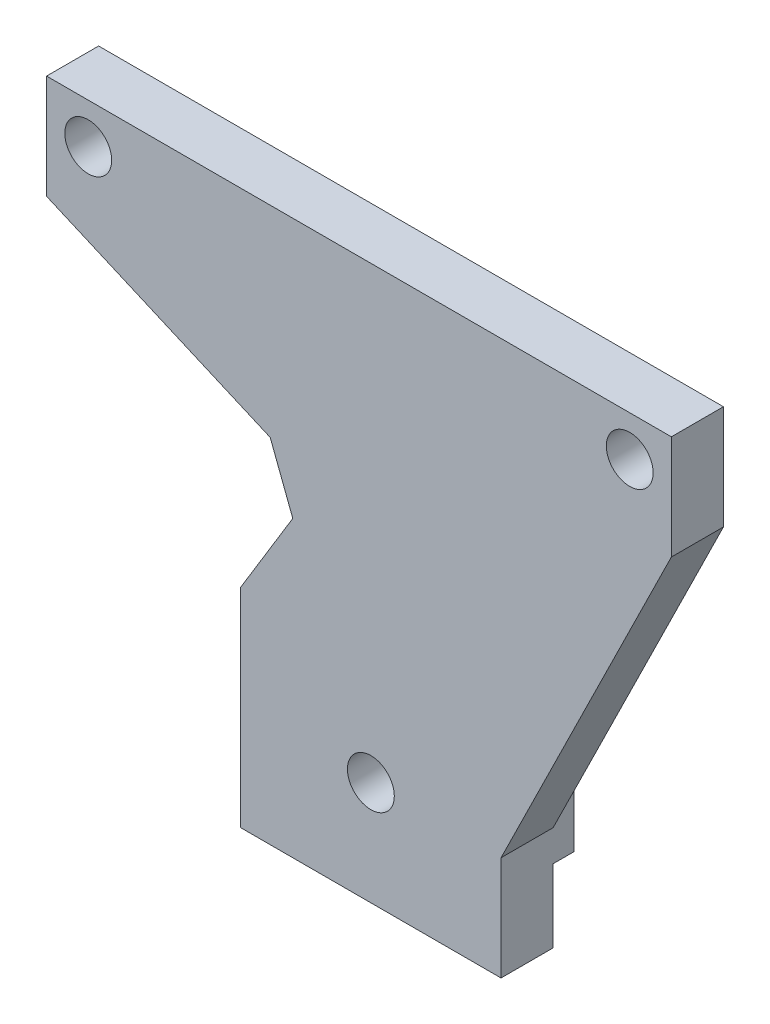
ISO-10303-21;
HEADER;
FILE_DESCRIPTION(('STEP AP214'),'2;1');
FILE_NAME('part.step','',(''),(''),'','','');
FILE_SCHEMA(('AUTOMOTIVE_DESIGN { 1 0 10303 214 1 1 1 1 }'));
ENDSEC;
DATA;
#1=APPLICATION_CONTEXT('core data for automotive mechanical design processes');
#2=APPLICATION_PROTOCOL_DEFINITION('international standard','automotive_design',2000,#1);
#3=PRODUCT_CONTEXT('',#1,'mechanical');
#4=PRODUCT('Part','Part','',(#3));
#5=PRODUCT_RELATED_PRODUCT_CATEGORY('part','',(#4));
#6=PRODUCT_DEFINITION_FORMATION('','',#4);
#7=PRODUCT_DEFINITION_CONTEXT('part definition',#1,'design');
#8=PRODUCT_DEFINITION('design','',#6,#7);
#9=PRODUCT_DEFINITION_SHAPE('','',#8);
#10=(LENGTH_UNIT() NAMED_UNIT(*) SI_UNIT(.MILLI.,.METRE.));
#11=(NAMED_UNIT(*) PLANE_ANGLE_UNIT() SI_UNIT($,.RADIAN.));
#12=(NAMED_UNIT(*) SI_UNIT($,.STERADIAN.) SOLID_ANGLE_UNIT());
#13=UNCERTAINTY_MEASURE_WITH_UNIT(LENGTH_MEASURE(1.E-05),#10,'distance_accuracy_value','');
#14=(GEOMETRIC_REPRESENTATION_CONTEXT(3) GLOBAL_UNCERTAINTY_ASSIGNED_CONTEXT((#13)) GLOBAL_UNIT_ASSIGNED_CONTEXT((#10,
#11,#12)) REPRESENTATION_CONTEXT('',''));
#15=CARTESIAN_POINT('',(0.,0.,0.));
#16=DIRECTION('',(0.,0.,1.));
#17=DIRECTION('',(1.,0.,0.));
#18=AXIS2_PLACEMENT_3D('',#15,#16,#17);
#19=CARTESIAN_POINT('',(0.,0.,0.));
#20=DIRECTION('',(-1.,0.,0.));
#21=DIRECTION('',(0.,0.,1.));
#22=AXIS2_PLACEMENT_3D('',#19,#20,#21);
#23=PLANE('',#22);
#24=DIRECTION('',(0.,-1.,0.));
#25=VECTOR('',#24,1.);
#26=CARTESIAN_POINT('',(0.,0.,5.));
#27=LINE('',#26,#25);
#28=CARTESIAN_POINT('',(0.,0.,5.));
#29=VERTEX_POINT('',#28);
#30=CARTESIAN_POINT('',(0.,-10.,5.));
#31=VERTEX_POINT('',#30);
#32=EDGE_CURVE('E46',#29,#31,#27,.T.);
#33=ORIENTED_EDGE('',*,*,#32,.T.);
#34=DIRECTION('',(0.,0.,-1.));
#35=VECTOR('',#34,1.);
#36=CARTESIAN_POINT('',(0.,-10.,5.));
#37=LINE('',#36,#35);
#38=CARTESIAN_POINT('',(0.,-10.,0.));
#39=VERTEX_POINT('',#38);
#40=EDGE_CURVE('E12',#31,#39,#37,.T.);
#41=ORIENTED_EDGE('',*,*,#40,.T.);
#42=DIRECTION('',(0.,-1.,0.));
#43=VECTOR('',#42,1.);
#44=CARTESIAN_POINT('',(0.,0.,0.));
#45=LINE('',#44,#43);
#46=CARTESIAN_POINT('',(0.,0.,0.));
#47=VERTEX_POINT('',#46);
#48=EDGE_CURVE('E54',#47,#39,#45,.T.);
#49=ORIENTED_EDGE('',*,*,#48,.F.);
#50=DIRECTION('',(0.,0.,-1.));
#51=VECTOR('',#50,1.);
#52=CARTESIAN_POINT('',(0.,0.,5.));
#53=LINE('',#52,#51);
#54=EDGE_CURVE('E41',#29,#47,#53,.T.);
#55=ORIENTED_EDGE('',*,*,#54,.F.);
#56=EDGE_LOOP('',(#33,#41,#49,#55));
#57=FACE_BOUND('',#56,.T.);
#58=ADVANCED_FACE('F38',(#57),#23,.F.);
#59=CARTESIAN_POINT('',(0.,0.,5.));
#60=DIRECTION('',(0.,-1.,0.));
#61=DIRECTION('',(0.,0.,-1.));
#62=AXIS2_PLACEMENT_3D('',#59,#60,#61);
#63=PLANE('',#62);
#64=DIRECTION('',(-1.,0.,0.));
#65=VECTOR('',#64,1.);
#66=CARTESIAN_POINT('',(0.,0.,5.));
#67=LINE('',#66,#65);
#68=CARTESIAN_POINT('',(-60.,0.,5.));
#69=VERTEX_POINT('',#68);
#70=EDGE_CURVE('E249',#29,#69,#67,.T.);
#71=ORIENTED_EDGE('',*,*,#70,.F.);
#72=ORIENTED_EDGE('',*,*,#54,.T.);
#73=DIRECTION('',(-1.,0.,0.));
#74=VECTOR('',#73,1.);
#75=CARTESIAN_POINT('',(0.,0.,0.));
#76=LINE('',#75,#74);
#77=CARTESIAN_POINT('',(-60.,0.,0.));
#78=VERTEX_POINT('',#77);
#79=EDGE_CURVE('E238',#47,#78,#76,.T.);
#80=ORIENTED_EDGE('',*,*,#79,.T.);
#81=DIRECTION('',(0.,0.,-1.));
#82=VECTOR('',#81,1.);
#83=CARTESIAN_POINT('',(-60.,0.,5.));
#84=LINE('',#83,#82);
#85=EDGE_CURVE('E197',#69,#78,#84,.T.);
#86=ORIENTED_EDGE('',*,*,#85,.F.);
#87=EDGE_LOOP('',(#71,#72,#80,#86));
#88=FACE_BOUND('',#87,.T.);
#89=ADVANCED_FACE('F257',(#88),#63,.F.);
#90=CARTESIAN_POINT('',(0.,0.,5.));
#91=DIRECTION('',(0.,0.,1.));
#92=DIRECTION('',(1.,0.,0.));
#93=AXIS2_PLACEMENT_3D('',#90,#91,#92);
#94=PLANE('',#93);
#95=ORIENTED_EDGE('',*,*,#32,.F.);
#96=ORIENTED_EDGE('',*,*,#70,.T.);
#97=DIRECTION('',(0.,1.,0.));
#98=VECTOR('',#97,1.);
#99=CARTESIAN_POINT('',(-60.,0.,5.));
#100=LINE('',#99,#98);
#101=CARTESIAN_POINT('',(-60.,-10.,5.));
#102=VERTEX_POINT('',#101);
#103=EDGE_CURVE('E195',#102,#69,#100,.T.);
#104=ORIENTED_EDGE('',*,*,#103,.F.);
#105=DIRECTION('',(-0.917432042877984,0.397892506464659,0.));
#106=VECTOR('',#105,1.);
#107=CARTESIAN_POINT('',(-38.5227399227401,-19.3147398877922,5.));
#108=LINE('',#107,#106);
#109=CARTESIAN_POINT('',(-38.5227399227401,-19.3147398877922,5.));
#110=VERTEX_POINT('',#109);
#111=EDGE_CURVE('E192',#110,#102,#108,.T.);
#112=ORIENTED_EDGE('',*,*,#111,.F.);
#113=DIRECTION('',(-0.357936011632449,0.933746117302051,0.));
#114=VECTOR('',#113,1.);
#115=CARTESIAN_POINT('',(-36.3557169880903,-24.9678431955744,5.));
#116=LINE('',#115,#114);
#117=CARTESIAN_POINT('',(-36.3557169880903,-24.9678431955744,5.));
#118=VERTEX_POINT('',#117);
#119=EDGE_CURVE('E189',#118,#110,#116,.T.);
#120=ORIENTED_EDGE('',*,*,#119,.F.);
#121=DIRECTION('',(0.519762211169418,0.854310976073864,0.));
#122=VECTOR('',#121,1.);
#123=CARTESIAN_POINT('',(-41.3569249684672,-33.1881154266996,5.));
#124=LINE('',#123,#122);
#125=CARTESIAN_POINT('',(-41.3569249684672,-33.1881154266996,5.));
#126=VERTEX_POINT('',#125);
#127=EDGE_CURVE('E186',#126,#118,#124,.T.);
#128=ORIENTED_EDGE('',*,*,#127,.F.);
#129=DIRECTION('',(0.,1.,0.));
#130=VECTOR('',#129,1.);
#131=CARTESIAN_POINT('',(-41.3569249684672,-53.1881154266996,5.));
#132=LINE('',#131,#130);
#133=CARTESIAN_POINT('',(-41.3569249684672,-53.1881154266996,5.));
#134=VERTEX_POINT('',#133);
#135=EDGE_CURVE('E183',#134,#126,#132,.T.);
#136=ORIENTED_EDGE('',*,*,#135,.F.);
#137=DIRECTION('',(-1.,0.,0.));
#138=VECTOR('',#137,1.);
#139=CARTESIAN_POINT('',(-16.3569249684672,-53.1881154266996,5.));
#140=LINE('',#139,#138);
#141=CARTESIAN_POINT('',(-16.3569249684672,-53.1881154266996,5.));
#142=VERTEX_POINT('',#141);
#143=EDGE_CURVE('E180',#142,#134,#140,.T.);
#144=ORIENTED_EDGE('',*,*,#143,.F.);
#145=DIRECTION('',(0.,-1.,0.));
#146=VECTOR('',#145,1.);
#147=CARTESIAN_POINT('',(-16.3569249684672,-43.1881154266996,5.));
#148=LINE('',#147,#146);
#149=CARTESIAN_POINT('',(-16.3569249684672,-43.1881154266996,5.));
#150=VERTEX_POINT('',#149);
#151=EDGE_CURVE('E176',#150,#142,#148,.T.);
#152=ORIENTED_EDGE('',*,*,#151,.F.);
#153=DIRECTION('',(-0.442079053201817,-0.896976092613502,0.));
#154=VECTOR('',#153,1.);
#155=CARTESIAN_POINT('',(0.,-10.,5.));
#156=LINE('',#155,#154);
#157=EDGE_CURVE('E174',#31,#150,#156,.T.);
#158=ORIENTED_EDGE('',*,*,#157,.F.);
#159=EDGE_LOOP('',(#95,#96,#104,#112,#120,#128,#136,#144,#152,#158));
#160=FACE_BOUND('',#159,.T.);
#161=CARTESIAN_POINT('',(-56.,-3.88,5.));
#162=DIRECTION('',(0.,0.,-1.));
#163=DIRECTION('',(-1.,0.,0.));
#164=AXIS2_PLACEMENT_3D('',#161,#162,#163);
#165=CIRCLE('',#164,2.25);
#166=CARTESIAN_POINT('',(-58.25,-3.88,5.));
#167=VERTEX_POINT('',#166);
#168=EDGE_CURVE('E248',#167,#167,#165,.T.);
#169=ORIENTED_EDGE('',*,*,#168,.T.);
#170=EDGE_LOOP('',(#169));
#171=FACE_BOUND('',#170,.T.);
#172=CARTESIAN_POINT('',(-4.,-3.88,5.));
#173=DIRECTION('',(0.,0.,-1.));
#174=DIRECTION('',(-1.,0.,0.));
#175=AXIS2_PLACEMENT_3D('',#172,#173,#174);
#176=CIRCLE('',#175,2.25);
#177=CARTESIAN_POINT('',(-6.25,-3.88,5.));
#178=VERTEX_POINT('',#177);
#179=EDGE_CURVE('E243',#178,#178,#176,.T.);
#180=ORIENTED_EDGE('',*,*,#179,.T.);
#181=EDGE_LOOP('',(#180));
#182=FACE_BOUND('',#181,.T.);
#183=CARTESIAN_POINT('',(-28.8569249684672,-43.1881154266996,5.));
#184=DIRECTION('',(0.,0.,-1.));
#185=DIRECTION('',(-1.,0.,0.));
#186=AXIS2_PLACEMENT_3D('',#183,#184,#185);
#187=CIRCLE('',#186,2.25);
#188=CARTESIAN_POINT('',(-31.1069249684672,-43.1881154266996,5.));
#189=VERTEX_POINT('',#188);
#190=EDGE_CURVE('E244',#189,#189,#187,.T.);
#191=ORIENTED_EDGE('',*,*,#190,.T.);
#192=EDGE_LOOP('',(#191));
#193=FACE_BOUND('',#192,.T.);
#194=ADVANCED_FACE('F268',(#160,#171,#182,#193),#94,.T.);
#195=CARTESIAN_POINT('',(0.,0.,0.));
#196=DIRECTION('',(0.,0.,1.));
#197=DIRECTION('',(1.,0.,0.));
#198=AXIS2_PLACEMENT_3D('',#195,#196,#197);
#199=PLANE('',#198);
#200=ORIENTED_EDGE('',*,*,#79,.F.);
#201=ORIENTED_EDGE('',*,*,#48,.T.);
#202=DIRECTION('',(-0.442079053201817,-0.896976092613502,0.));
#203=VECTOR('',#202,1.);
#204=CARTESIAN_POINT('',(0.,-10.,0.));
#205=LINE('',#204,#203);
#206=CARTESIAN_POINT('',(-16.3569249684672,-43.1881154266996,0.));
#207=VERTEX_POINT('',#206);
#208=EDGE_CURVE('E166',#39,#207,#205,.T.);
#209=ORIENTED_EDGE('',*,*,#208,.T.);
#210=DIRECTION('',(0.,-1.,0.));
#211=VECTOR('',#210,1.);
#212=CARTESIAN_POINT('',(-16.3569249684672,-40.1881154266996,0.));
#213=LINE('',#212,#211);
#214=CARTESIAN_POINT('',(-16.3569249684672,-40.1881154266996,0.));
#215=VERTEX_POINT('',#214);
#216=EDGE_CURVE('E273',#215,#207,#213,.T.);
#217=ORIENTED_EDGE('',*,*,#216,.F.);
#218=DIRECTION('',(1.,0.,0.));
#219=VECTOR('',#218,1.);
#220=CARTESIAN_POINT('',(-41.3569249684672,-40.1881154266996,0.));
#221=LINE('',#220,#219);
#222=CARTESIAN_POINT('',(-41.3569249684672,-40.1881154266996,0.));
#223=VERTEX_POINT('',#222);
#224=EDGE_CURVE('E152',#223,#215,#221,.T.);
#225=ORIENTED_EDGE('',*,*,#224,.F.);
#226=DIRECTION('',(0.,1.,0.));
#227=VECTOR('',#226,1.);
#228=CARTESIAN_POINT('',(-41.3569249684672,-53.1881154266996,0.));
#229=LINE('',#228,#227);
#230=CARTESIAN_POINT('',(-41.3569249684672,-33.1881154266996,0.));
#231=VERTEX_POINT('',#230);
#232=EDGE_CURVE('E203',#223,#231,#229,.T.);
#233=ORIENTED_EDGE('',*,*,#232,.T.);
#234=DIRECTION('',(0.519762211169418,0.854310976073864,0.));
#235=VECTOR('',#234,1.);
#236=CARTESIAN_POINT('',(-41.3569249684672,-33.1881154266996,0.));
#237=LINE('',#236,#235);
#238=CARTESIAN_POINT('',(-36.3557169880903,-24.9678431955744,0.));
#239=VERTEX_POINT('',#238);
#240=EDGE_CURVE('E207',#231,#239,#237,.T.);
#241=ORIENTED_EDGE('',*,*,#240,.T.);
#242=DIRECTION('',(-0.357936011632449,0.933746117302051,0.));
#243=VECTOR('',#242,1.);
#244=CARTESIAN_POINT('',(-36.3557169880903,-24.9678431955744,0.));
#245=LINE('',#244,#243);
#246=CARTESIAN_POINT('',(-38.5227399227401,-19.3147398877922,0.));
#247=VERTEX_POINT('',#246);
#248=EDGE_CURVE('E210',#239,#247,#245,.T.);
#249=ORIENTED_EDGE('',*,*,#248,.T.);
#250=DIRECTION('',(-0.917432042877984,0.397892506464659,0.));
#251=VECTOR('',#250,1.);
#252=CARTESIAN_POINT('',(-38.5227399227401,-19.3147398877922,0.));
#253=LINE('',#252,#251);
#254=CARTESIAN_POINT('',(-60.,-10.,0.));
#255=VERTEX_POINT('',#254);
#256=EDGE_CURVE('E213',#247,#255,#253,.T.);
#257=ORIENTED_EDGE('',*,*,#256,.T.);
#258=DIRECTION('',(0.,1.,0.));
#259=VECTOR('',#258,1.);
#260=CARTESIAN_POINT('',(-60.,0.,0.));
#261=LINE('',#260,#259);
#262=EDGE_CURVE('E177',#255,#78,#261,.T.);
#263=ORIENTED_EDGE('',*,*,#262,.T.);
#264=EDGE_LOOP('',(#200,#201,#209,#217,#225,#233,#241,#249,#257,#263));
#265=FACE_BOUND('',#264,.T.);
#266=CARTESIAN_POINT('',(-56.,-3.88,0.));
#267=DIRECTION('',(0.,0.,-1.));
#268=DIRECTION('',(-1.,0.,0.));
#269=AXIS2_PLACEMENT_3D('',#266,#267,#268);
#270=CIRCLE('',#269,2.25);
#271=CARTESIAN_POINT('',(-58.25,-3.88,0.));
#272=VERTEX_POINT('',#271);
#273=EDGE_CURVE('E245',#272,#272,#270,.T.);
#274=ORIENTED_EDGE('',*,*,#273,.F.);
#275=EDGE_LOOP('',(#274));
#276=FACE_BOUND('',#275,.T.);
#277=CARTESIAN_POINT('',(-4.,-3.88,0.));
#278=DIRECTION('',(0.,0.,-1.));
#279=DIRECTION('',(-1.,0.,0.));
#280=AXIS2_PLACEMENT_3D('',#277,#278,#279);
#281=CIRCLE('',#280,2.25);
#282=CARTESIAN_POINT('',(-6.25,-3.88,0.));
#283=VERTEX_POINT('',#282);
#284=EDGE_CURVE('E240',#283,#283,#281,.T.);
#285=ORIENTED_EDGE('',*,*,#284,.F.);
#286=EDGE_LOOP('',(#285));
#287=FACE_BOUND('',#286,.T.);
#288=ADVANCED_FACE('F259',(#265,#276,#287),#199,.F.);
#289=CARTESIAN_POINT('',(0.,0.,0.));
#290=DIRECTION('',(0.,0.,1.));
#291=DIRECTION('',(-1.,0.,0.));
#292=AXIS2_PLACEMENT_3D('',#289,#290,#291);
#293=PLANE('',#292);
#294=DIRECTION('',(1.,0.,0.));
#295=VECTOR('',#294,1.);
#296=CARTESIAN_POINT('',(-41.3569249684672,-46.1881154266996,0.));
#297=LINE('',#296,#295);
#298=CARTESIAN_POINT('',(-41.3569249684672,-46.1881154266996,0.));
#299=VERTEX_POINT('',#298);
#300=CARTESIAN_POINT('',(-16.3569249684672,-46.1881154266996,0.));
#301=VERTEX_POINT('',#300);
#302=EDGE_CURVE('E276',#299,#301,#297,.T.);
#303=ORIENTED_EDGE('',*,*,#302,.T.);
#304=DIRECTION('',(0.,-1.,0.));
#305=VECTOR('',#304,1.);
#306=CARTESIAN_POINT('',(-16.3569249684672,-43.1881154266996,0.));
#307=LINE('',#306,#305);
#308=CARTESIAN_POINT('',(-16.3569249684672,-53.1881154266996,0.));
#309=VERTEX_POINT('',#308);
#310=EDGE_CURVE('E164',#301,#309,#307,.T.);
#311=ORIENTED_EDGE('',*,*,#310,.T.);
#312=DIRECTION('',(-1.,0.,0.));
#313=VECTOR('',#312,1.);
#314=CARTESIAN_POINT('',(-16.3569249684672,-53.1881154266996,0.));
#315=LINE('',#314,#313);
#316=CARTESIAN_POINT('',(-41.3569249684672,-53.1881154266996,0.));
#317=VERTEX_POINT('',#316);
#318=EDGE_CURVE('E200',#309,#317,#315,.T.);
#319=ORIENTED_EDGE('',*,*,#318,.T.);
#320=EDGE_CURVE('E204',#317,#299,#229,.T.);
#321=ORIENTED_EDGE('',*,*,#320,.T.);
#322=EDGE_LOOP('',(#303,#311,#319,#321));
#323=FACE_BOUND('',#322,.T.);
#324=ADVANCED_FACE('F331',(#323),#293,.F.);
#325=CARTESIAN_POINT('',(0.,-10.,5.));
#326=DIRECTION('',(-0.896976092613502,0.442079053201817,0.));
#327=DIRECTION('',(0.442079053201817,0.896976092613502,0.));
#328=AXIS2_PLACEMENT_3D('',#325,#326,#327);
#329=PLANE('',#328);
#330=ORIENTED_EDGE('',*,*,#208,.F.);
#331=ORIENTED_EDGE('',*,*,#40,.F.);
#332=ORIENTED_EDGE('',*,*,#157,.T.);
#333=DIRECTION('',(0.,0.,-1.));
#334=VECTOR('',#333,1.);
#335=CARTESIAN_POINT('',(-16.3569249684672,-43.1881154266996,5.));
#336=LINE('',#335,#334);
#337=EDGE_CURVE('E236',#150,#207,#336,.T.);
#338=ORIENTED_EDGE('',*,*,#337,.T.);
#339=EDGE_LOOP('',(#330,#331,#332,#338));
#340=FACE_BOUND('',#339,.T.);
#341=ADVANCED_FACE('F271',(#340),#329,.F.);
#342=CARTESIAN_POINT('',(-16.3569249684672,-43.1881154266996,5.));
#343=DIRECTION('',(-1.,0.,0.));
#344=DIRECTION('',(0.,0.,-1.));
#345=AXIS2_PLACEMENT_3D('',#342,#343,#344);
#346=PLANE('',#345);
#347=ORIENTED_EDGE('',*,*,#337,.F.);
#348=ORIENTED_EDGE('',*,*,#151,.T.);
#349=DIRECTION('',(0.,0.,-1.));
#350=VECTOR('',#349,1.);
#351=CARTESIAN_POINT('',(-16.3569249684672,-53.1881154266996,5.));
#352=LINE('',#351,#350);
#353=EDGE_CURVE('E234',#142,#309,#352,.T.);
#354=ORIENTED_EDGE('',*,*,#353,.T.);
#355=ORIENTED_EDGE('',*,*,#310,.F.);
#356=DIRECTION('',(0.,0.,1.));
#357=VECTOR('',#356,1.);
#358=CARTESIAN_POINT('',(-16.3569249684672,-46.1881154266996,-2.));
#359=LINE('',#358,#357);
#360=CARTESIAN_POINT('',(-16.3569249684672,-46.1881154266996,-2.));
#361=VERTEX_POINT('',#360);
#362=EDGE_CURVE('E145',#361,#301,#359,.T.);
#363=ORIENTED_EDGE('',*,*,#362,.F.);
#364=DIRECTION('',(0.,-1.,0.));
#365=VECTOR('',#364,1.);
#366=CARTESIAN_POINT('',(-16.3569249684672,-40.1881154266996,-2.));
#367=LINE('',#366,#365);
#368=CARTESIAN_POINT('',(-16.3569249684672,-40.1881154266996,-2.));
#369=VERTEX_POINT('',#368);
#370=EDGE_CURVE('E151',#369,#361,#367,.T.);
#371=ORIENTED_EDGE('',*,*,#370,.F.);
#372=DIRECTION('',(0.,0.,1.));
#373=VECTOR('',#372,1.);
#374=CARTESIAN_POINT('',(-16.3569249684672,-40.1881154266996,-2.));
#375=LINE('',#374,#373);
#376=EDGE_CURVE('E167',#369,#215,#375,.T.);
#377=ORIENTED_EDGE('',*,*,#376,.T.);
#378=ORIENTED_EDGE('',*,*,#216,.T.);
#379=EDGE_LOOP('',(#347,#348,#354,#355,#363,#371,#377,#378));
#380=FACE_BOUND('',#379,.T.);
#381=ADVANCED_FACE('F162',(#380),#346,.F.);
#382=CARTESIAN_POINT('',(-16.3569249684672,-53.1881154266996,5.));
#383=DIRECTION('',(0.,1.,0.));
#384=DIRECTION('',(0.,0.,1.));
#385=AXIS2_PLACEMENT_3D('',#382,#383,#384);
#386=PLANE('',#385);
#387=ORIENTED_EDGE('',*,*,#318,.F.);
#388=ORIENTED_EDGE('',*,*,#353,.F.);
#389=ORIENTED_EDGE('',*,*,#143,.T.);
#390=DIRECTION('',(0.,0.,-1.));
#391=VECTOR('',#390,1.);
#392=CARTESIAN_POINT('',(-41.3569249684672,-53.1881154266996,5.));
#393=LINE('',#392,#391);
#394=EDGE_CURVE('E232',#134,#317,#393,.T.);
#395=ORIENTED_EDGE('',*,*,#394,.T.);
#396=EDGE_LOOP('',(#387,#388,#389,#395));
#397=FACE_BOUND('',#396,.T.);
#398=ADVANCED_FACE('F346',(#397),#386,.F.);
#399=CARTESIAN_POINT('',(-41.3569249684672,-53.1881154266996,5.));
#400=DIRECTION('',(1.,0.,0.));
#401=DIRECTION('',(0.,0.,1.));
#402=AXIS2_PLACEMENT_3D('',#399,#400,#401);
#403=PLANE('',#402);
#404=ORIENTED_EDGE('',*,*,#320,.F.);
#405=ORIENTED_EDGE('',*,*,#394,.F.);
#406=ORIENTED_EDGE('',*,*,#135,.T.);
#407=DIRECTION('',(0.,0.,-1.));
#408=VECTOR('',#407,1.);
#409=CARTESIAN_POINT('',(-41.3569249684672,-33.1881154266996,5.));
#410=LINE('',#409,#408);
#411=EDGE_CURVE('E229',#126,#231,#410,.T.);
#412=ORIENTED_EDGE('',*,*,#411,.T.);
#413=ORIENTED_EDGE('',*,*,#232,.F.);
#414=DIRECTION('',(0.,0.,1.));
#415=VECTOR('',#414,1.);
#416=CARTESIAN_POINT('',(-41.3569249684672,-40.1881154266996,-2.));
#417=LINE('',#416,#415);
#418=CARTESIAN_POINT('',(-41.3569249684672,-40.1881154266996,-2.));
#419=VERTEX_POINT('',#418);
#420=EDGE_CURVE('E170',#419,#223,#417,.T.);
#421=ORIENTED_EDGE('',*,*,#420,.F.);
#422=DIRECTION('',(0.,-1.,0.));
#423=VECTOR('',#422,1.);
#424=CARTESIAN_POINT('',(-41.3569249684672,-40.1881154266996,-2.));
#425=LINE('',#424,#423);
#426=CARTESIAN_POINT('',(-41.3569249684672,-46.1881154266996,-2.));
#427=VERTEX_POINT('',#426);
#428=EDGE_CURVE('E285',#419,#427,#425,.T.);
#429=ORIENTED_EDGE('',*,*,#428,.T.);
#430=DIRECTION('',(0.,0.,1.));
#431=VECTOR('',#430,1.);
#432=CARTESIAN_POINT('',(-41.3569249684672,-46.1881154266996,-2.));
#433=LINE('',#432,#431);
#434=EDGE_CURVE('E147',#427,#299,#433,.T.);
#435=ORIENTED_EDGE('',*,*,#434,.T.);
#436=EDGE_LOOP('',(#404,#405,#406,#412,#413,#421,#429,#435));
#437=FACE_BOUND('',#436,.T.);
#438=ADVANCED_FACE('F349',(#437),#403,.F.);
#439=CARTESIAN_POINT('',(-41.3569249684672,-33.1881154266996,5.));
#440=DIRECTION('',(0.854310976073864,-0.519762211169418,0.));
#441=DIRECTION('',(-0.519762211169418,-0.854310976073864,0.));
#442=AXIS2_PLACEMENT_3D('',#439,#440,#441);
#443=PLANE('',#442);
#444=ORIENTED_EDGE('',*,*,#240,.F.);
#445=ORIENTED_EDGE('',*,*,#411,.F.);
#446=ORIENTED_EDGE('',*,*,#127,.T.);
#447=DIRECTION('',(0.,0.,-1.));
#448=VECTOR('',#447,1.);
#449=CARTESIAN_POINT('',(-36.3557169880903,-24.9678431955744,5.));
#450=LINE('',#449,#448);
#451=EDGE_CURVE('E226',#118,#239,#450,.T.);
#452=ORIENTED_EDGE('',*,*,#451,.T.);
#453=EDGE_LOOP('',(#444,#445,#446,#452));
#454=FACE_BOUND('',#453,.T.);
#455=ADVANCED_FACE('F353',(#454),#443,.F.);
#456=CARTESIAN_POINT('',(-36.3557169880903,-24.9678431955744,5.));
#457=DIRECTION('',(0.933746117302051,0.357936011632449,0.));
#458=DIRECTION('',(0.357936011632449,-0.933746117302051,0.));
#459=AXIS2_PLACEMENT_3D('',#456,#457,#458);
#460=PLANE('',#459);
#461=ORIENTED_EDGE('',*,*,#248,.F.);
#462=ORIENTED_EDGE('',*,*,#451,.F.);
#463=ORIENTED_EDGE('',*,*,#119,.T.);
#464=DIRECTION('',(0.,0.,-1.));
#465=VECTOR('',#464,1.);
#466=CARTESIAN_POINT('',(-38.5227399227401,-19.3147398877922,5.));
#467=LINE('',#466,#465);
#468=EDGE_CURVE('E223',#110,#247,#467,.T.);
#469=ORIENTED_EDGE('',*,*,#468,.T.);
#470=EDGE_LOOP('',(#461,#462,#463,#469));
#471=FACE_BOUND('',#470,.T.);
#472=ADVANCED_FACE('F356',(#471),#460,.F.);
#473=CARTESIAN_POINT('',(-38.5227399227401,-19.3147398877922,5.));
#474=DIRECTION('',(0.397892506464658,0.917432042877984,0.));
#475=DIRECTION('',(0.917432042877985,-0.397892506464659,0.));
#476=AXIS2_PLACEMENT_3D('',#473,#474,#475);
#477=PLANE('',#476);
#478=ORIENTED_EDGE('',*,*,#256,.F.);
#479=ORIENTED_EDGE('',*,*,#468,.F.);
#480=ORIENTED_EDGE('',*,*,#111,.T.);
#481=DIRECTION('',(0.,0.,-1.));
#482=VECTOR('',#481,1.);
#483=CARTESIAN_POINT('',(-60.,-10.,5.));
#484=LINE('',#483,#482);
#485=EDGE_CURVE('E220',#102,#255,#484,.T.);
#486=ORIENTED_EDGE('',*,*,#485,.T.);
#487=EDGE_LOOP('',(#478,#479,#480,#486));
#488=FACE_BOUND('',#487,.T.);
#489=ADVANCED_FACE('F265',(#488),#477,.F.);
#490=CARTESIAN_POINT('',(-60.,0.,5.));
#491=DIRECTION('',(1.,0.,0.));
#492=DIRECTION('',(0.,0.,1.));
#493=AXIS2_PLACEMENT_3D('',#490,#491,#492);
#494=PLANE('',#493);
#495=ORIENTED_EDGE('',*,*,#262,.F.);
#496=ORIENTED_EDGE('',*,*,#485,.F.);
#497=ORIENTED_EDGE('',*,*,#103,.T.);
#498=ORIENTED_EDGE('',*,*,#85,.T.);
#499=EDGE_LOOP('',(#495,#496,#497,#498));
#500=FACE_BOUND('',#499,.T.);
#501=ADVANCED_FACE('F263',(#500),#494,.F.);
#502=CARTESIAN_POINT('',(-41.3569249684672,-46.1881154266996,-2.));
#503=DIRECTION('',(0.,1.,0.));
#504=DIRECTION('',(0.,0.,1.));
#505=AXIS2_PLACEMENT_3D('',#502,#503,#504);
#506=PLANE('',#505);
#507=ORIENTED_EDGE('',*,*,#302,.F.);
#508=ORIENTED_EDGE('',*,*,#434,.F.);
#509=DIRECTION('',(1.,0.,0.));
#510=VECTOR('',#509,1.);
#511=CARTESIAN_POINT('',(-41.3569249684672,-46.1881154266996,-2.));
#512=LINE('',#511,#510);
#513=EDGE_CURVE('E140',#427,#361,#512,.T.);
#514=ORIENTED_EDGE('',*,*,#513,.T.);
#515=ORIENTED_EDGE('',*,*,#362,.T.);
#516=EDGE_LOOP('',(#507,#508,#514,#515));
#517=FACE_BOUND('',#516,.T.);
#518=ADVANCED_FACE('F143',(#517),#506,.F.);
#519=CARTESIAN_POINT('',(-41.3569249684672,-40.1881154266996,-2.));
#520=DIRECTION('',(0.,1.,0.));
#521=DIRECTION('',(0.,0.,1.));
#522=AXIS2_PLACEMENT_3D('',#519,#520,#521);
#523=PLANE('',#522);
#524=ORIENTED_EDGE('',*,*,#224,.T.);
#525=ORIENTED_EDGE('',*,*,#376,.F.);
#526=DIRECTION('',(1.,0.,0.));
#527=VECTOR('',#526,1.);
#528=CARTESIAN_POINT('',(-41.3569249684672,-40.1881154266996,-2.));
#529=LINE('',#528,#527);
#530=EDGE_CURVE('E156',#419,#369,#529,.T.);
#531=ORIENTED_EDGE('',*,*,#530,.F.);
#532=ORIENTED_EDGE('',*,*,#420,.T.);
#533=EDGE_LOOP('',(#524,#525,#531,#532));
#534=FACE_BOUND('',#533,.T.);
#535=ADVANCED_FACE('F279',(#534),#523,.T.);
#536=CARTESIAN_POINT('',(0.,0.,-2.));
#537=DIRECTION('',(0.,0.,1.));
#538=DIRECTION('',(-1.,0.,0.));
#539=AXIS2_PLACEMENT_3D('',#536,#537,#538);
#540=PLANE('',#539);
#541=CARTESIAN_POINT('',(-28.8569249684672,-43.1881154266996,-2.));
#542=DIRECTION('',(0.,0.,1.));
#543=DIRECTION('',(1.,0.,0.));
#544=AXIS2_PLACEMENT_3D('',#541,#542,#543);
#545=CIRCLE('',#544,2.25);
#546=CARTESIAN_POINT('',(-26.6069249684672,-43.1881154266996,-2.));
#547=VERTEX_POINT('',#546);
#548=EDGE_CURVE('E299',#547,#547,#545,.T.);
#549=ORIENTED_EDGE('',*,*,#548,.T.);
#550=EDGE_LOOP('',(#549));
#551=FACE_BOUND('',#550,.T.);
#552=ORIENTED_EDGE('',*,*,#513,.F.);
#553=ORIENTED_EDGE('',*,*,#428,.F.);
#554=ORIENTED_EDGE('',*,*,#530,.T.);
#555=ORIENTED_EDGE('',*,*,#370,.T.);
#556=EDGE_LOOP('',(#552,#553,#554,#555));
#557=FACE_BOUND('',#556,.T.);
#558=ADVANCED_FACE('F155',(#551,#557),#540,.F.);
#559=CARTESIAN_POINT('',(-28.8569249684672,-43.1881154266996,6.1));
#560=DIRECTION('',(0.,0.,-1.));
#561=DIRECTION('',(1.,0.,0.));
#562=AXIS2_PLACEMENT_3D('',#559,#560,#561);
#563=CYLINDRICAL_SURFACE('',#562,2.25);
#564=ORIENTED_EDGE('',*,*,#190,.F.);
#565=EDGE_LOOP('',(#564));
#566=FACE_BOUND('',#565,.T.);
#567=ORIENTED_EDGE('',*,*,#548,.F.);
#568=EDGE_LOOP('',(#567));
#569=FACE_BOUND('',#568,.T.);
#570=ADVANCED_FACE('F304',(#566,#569),#563,.F.);
#571=CARTESIAN_POINT('',(-4.,-3.88,6.1));
#572=DIRECTION('',(0.,0.,-1.));
#573=DIRECTION('',(1.,0.,0.));
#574=AXIS2_PLACEMENT_3D('',#571,#572,#573);
#575=CYLINDRICAL_SURFACE('',#574,2.25);
#576=ORIENTED_EDGE('',*,*,#179,.F.);
#577=EDGE_LOOP('',(#576));
#578=FACE_BOUND('',#577,.T.);
#579=ORIENTED_EDGE('',*,*,#284,.T.);
#580=EDGE_LOOP('',(#579));
#581=FACE_BOUND('',#580,.T.);
#582=ADVANCED_FACE('F306',(#578,#581),#575,.F.);
#583=CARTESIAN_POINT('',(-56.,-3.88,6.1));
#584=DIRECTION('',(0.,0.,-1.));
#585=DIRECTION('',(1.,0.,0.));
#586=AXIS2_PLACEMENT_3D('',#583,#584,#585);
#587=CYLINDRICAL_SURFACE('',#586,2.25);
#588=ORIENTED_EDGE('',*,*,#168,.F.);
#589=EDGE_LOOP('',(#588));
#590=FACE_BOUND('',#589,.T.);
#591=ORIENTED_EDGE('',*,*,#273,.T.);
#592=EDGE_LOOP('',(#591));
#593=FACE_BOUND('',#592,.T.);
#594=ADVANCED_FACE('F313',(#590,#593),#587,.F.);
#595=CLOSED_SHELL('',(#58,#89,#194,#288,#324,#341,#381,#398,#438,#455,#472,#489,#501,#518,#535,
#558,#570,#582,#594));
#596=MANIFOLD_SOLID_BREP('B2',#595);
#597=ADVANCED_BREP_SHAPE_REPRESENTATION('',(#18,#596),#14);
#598=SHAPE_DEFINITION_REPRESENTATION(#9,#597);
ENDSEC;
END-ISO-10303-21;
